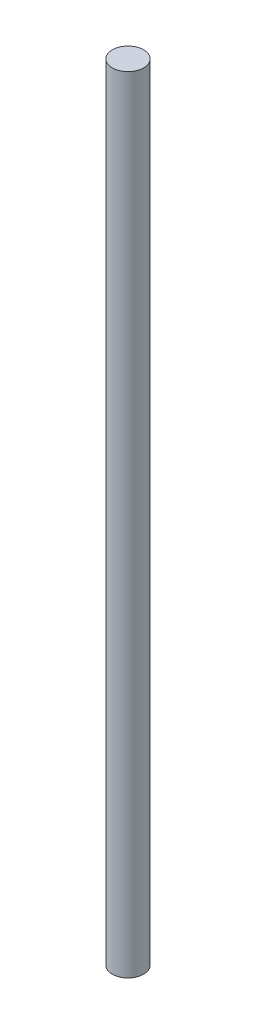
ISO-10303-21;
HEADER;
FILE_DESCRIPTION(('STEP AP214'),'2;1');
FILE_NAME('part.step','',(''),(''),'','','');
FILE_SCHEMA(('AUTOMOTIVE_DESIGN { 1 0 10303 214 1 1 1 1 }'));
ENDSEC;
DATA;
#1=APPLICATION_CONTEXT('core data for automotive mechanical design processes');
#2=APPLICATION_PROTOCOL_DEFINITION('international standard','automotive_design',2000,#1);
#3=PRODUCT_CONTEXT('',#1,'mechanical');
#4=PRODUCT('Part','Part','',(#3));
#5=PRODUCT_RELATED_PRODUCT_CATEGORY('part','',(#4));
#6=PRODUCT_DEFINITION_FORMATION('','',#4);
#7=PRODUCT_DEFINITION_CONTEXT('part definition',#1,'design');
#8=PRODUCT_DEFINITION('design','',#6,#7);
#9=PRODUCT_DEFINITION_SHAPE('','',#8);
#10=(LENGTH_UNIT() NAMED_UNIT(*) SI_UNIT(.MILLI.,.METRE.));
#11=(NAMED_UNIT(*) PLANE_ANGLE_UNIT() SI_UNIT($,.RADIAN.));
#12=(NAMED_UNIT(*) SI_UNIT($,.STERADIAN.) SOLID_ANGLE_UNIT());
#13=UNCERTAINTY_MEASURE_WITH_UNIT(LENGTH_MEASURE(1.E-05),#10,'distance_accuracy_value','');
#14=(GEOMETRIC_REPRESENTATION_CONTEXT(3) GLOBAL_UNCERTAINTY_ASSIGNED_CONTEXT((#13)) GLOBAL_UNIT_ASSIGNED_CONTEXT((#10,
#11,#12)) REPRESENTATION_CONTEXT('',''));
#15=CARTESIAN_POINT('',(0.,0.,0.));
#16=DIRECTION('',(0.,0.,1.));
#17=DIRECTION('',(1.,0.,0.));
#18=AXIS2_PLACEMENT_3D('',#15,#16,#17);
#19=CARTESIAN_POINT('',(0.,100.,0.));
#20=DIRECTION('',(0.,-1.,0.));
#21=DIRECTION('',(0.,0.,-1.));
#22=AXIS2_PLACEMENT_3D('',#19,#20,#21);
#23=CYLINDRICAL_SURFACE('',#22,2.);
#24=CARTESIAN_POINT('',(0.,100.,0.));
#25=DIRECTION('',(0.,1.,0.));
#26=DIRECTION('',(0.,0.,1.));
#27=AXIS2_PLACEMENT_3D('',#24,#25,#26);
#28=CIRCLE('',#27,2.);
#29=CARTESIAN_POINT('',(0.,100.,2.));
#30=VERTEX_POINT('',#29);
#31=EDGE_CURVE('E10',#30,#30,#28,.T.);
#32=ORIENTED_EDGE('',*,*,#31,.F.);
#33=EDGE_LOOP('',(#32));
#34=FACE_BOUND('',#33,.T.);
#35=CARTESIAN_POINT('',(0.,0.,0.));
#36=DIRECTION('',(0.,1.,0.));
#37=DIRECTION('',(0.,0.,1.));
#38=AXIS2_PLACEMENT_3D('',#35,#36,#37);
#39=CIRCLE('',#38,2.);
#40=CARTESIAN_POINT('',(0.,0.,2.));
#41=VERTEX_POINT('',#40);
#42=EDGE_CURVE('E40',#41,#41,#39,.T.);
#43=ORIENTED_EDGE('',*,*,#42,.T.);
#44=EDGE_LOOP('',(#43));
#45=FACE_BOUND('',#44,.T.);
#46=ADVANCED_FACE('F37',(#34,#45),#23,.T.);
#47=CARTESIAN_POINT('',(0.,100.,0.));
#48=DIRECTION('',(0.,1.,0.));
#49=DIRECTION('',(0.,0.,1.));
#50=AXIS2_PLACEMENT_3D('',#47,#48,#49);
#51=PLANE('',#50);
#52=ORIENTED_EDGE('',*,*,#31,.T.);
#53=EDGE_LOOP('',(#52));
#54=FACE_BOUND('',#53,.T.);
#55=ADVANCED_FACE('F54',(#54),#51,.T.);
#56=CARTESIAN_POINT('',(0.,0.,0.));
#57=DIRECTION('',(0.,1.,0.));
#58=DIRECTION('',(0.,0.,1.));
#59=AXIS2_PLACEMENT_3D('',#56,#57,#58);
#60=PLANE('',#59);
#61=ORIENTED_EDGE('',*,*,#42,.F.);
#62=EDGE_LOOP('',(#61));
#63=FACE_BOUND('',#62,.T.);
#64=ADVANCED_FACE('F52',(#63),#60,.F.);
#65=CLOSED_SHELL('',(#46,#55,#64));
#66=MANIFOLD_SOLID_BREP('B2',#65);
#67=ADVANCED_BREP_SHAPE_REPRESENTATION('',(#18,#66),#14);
#68=SHAPE_DEFINITION_REPRESENTATION(#9,#67);
ENDSEC;
END-ISO-10303-21;
